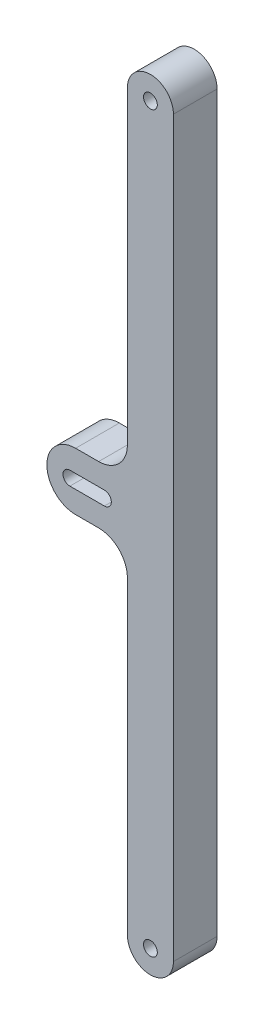
ISO-10303-21;
HEADER;
FILE_DESCRIPTION(('STEP AP214'),'2;1');
FILE_NAME('part.step','',(''),(''),'','','');
FILE_SCHEMA(('AUTOMOTIVE_DESIGN { 1 0 10303 214 1 1 1 1 }'));
ENDSEC;
DATA;
#1=APPLICATION_CONTEXT('core data for automotive mechanical design processes');
#2=APPLICATION_PROTOCOL_DEFINITION('international standard','automotive_design',2000,#1);
#3=PRODUCT_CONTEXT('',#1,'mechanical');
#4=PRODUCT('Part','Part','',(#3));
#5=PRODUCT_RELATED_PRODUCT_CATEGORY('part','',(#4));
#6=PRODUCT_DEFINITION_FORMATION('','',#4);
#7=PRODUCT_DEFINITION_CONTEXT('part definition',#1,'design');
#8=PRODUCT_DEFINITION('design','',#6,#7);
#9=PRODUCT_DEFINITION_SHAPE('','',#8);
#10=(LENGTH_UNIT() NAMED_UNIT(*) SI_UNIT(.MILLI.,.METRE.));
#11=(NAMED_UNIT(*) PLANE_ANGLE_UNIT() SI_UNIT($,.RADIAN.));
#12=(NAMED_UNIT(*) SI_UNIT($,.STERADIAN.) SOLID_ANGLE_UNIT());
#13=UNCERTAINTY_MEASURE_WITH_UNIT(LENGTH_MEASURE(1.E-05),#10,'distance_accuracy_value','');
#14=(GEOMETRIC_REPRESENTATION_CONTEXT(3) GLOBAL_UNCERTAINTY_ASSIGNED_CONTEXT((#13)) GLOBAL_UNIT_ASSIGNED_CONTEXT((#10,
#11,#12)) REPRESENTATION_CONTEXT('',''));
#15=CARTESIAN_POINT('',(0.,0.,0.));
#16=DIRECTION('',(0.,0.,1.));
#17=DIRECTION('',(1.,0.,0.));
#18=AXIS2_PLACEMENT_3D('',#15,#16,#17);
#19=CARTESIAN_POINT('',(-2.,-10.,0.));
#20=DIRECTION('',(-1.,0.,0.));
#21=DIRECTION('',(0.,0.,1.));
#22=AXIS2_PLACEMENT_3D('',#19,#20,#21);
#23=PLANE('',#22);
#24=DIRECTION('',(0.,1.,0.));
#25=VECTOR('',#24,1.);
#26=CARTESIAN_POINT('',(-2.,-10.,3.8));
#27=LINE('',#26,#25);
#28=CARTESIAN_POINT('',(-2.,-63.8,3.8));
#29=VERTEX_POINT('',#28);
#30=CARTESIAN_POINT('',(-2.,-36.9,3.8));
#31=VERTEX_POINT('',#30);
#32=EDGE_CURVE('E235',#29,#31,#27,.T.);
#33=ORIENTED_EDGE('',*,*,#32,.T.);
#34=DIRECTION('',(0.,0.,1.));
#35=VECTOR('',#34,1.);
#36=CARTESIAN_POINT('',(-2.,-36.9,0.));
#37=LINE('',#36,#35);
#38=CARTESIAN_POINT('',(-2.,-36.9,0.));
#39=VERTEX_POINT('',#38);
#40=EDGE_CURVE('E268',#31,#39,#37,.F.);
#41=ORIENTED_EDGE('',*,*,#40,.T.);
#42=DIRECTION('',(0.,1.,0.));
#43=VECTOR('',#42,1.);
#44=CARTESIAN_POINT('',(-2.,-10.,0.));
#45=LINE('',#44,#43);
#46=CARTESIAN_POINT('',(-2.,-63.8,0.));
#47=VERTEX_POINT('',#46);
#48=EDGE_CURVE('E226',#47,#39,#45,.T.);
#49=ORIENTED_EDGE('',*,*,#48,.F.);
#50=DIRECTION('',(0.,0.,1.));
#51=VECTOR('',#50,1.);
#52=CARTESIAN_POINT('',(-2.,-63.8,0.));
#53=LINE('',#52,#51);
#54=EDGE_CURVE('E201',#47,#29,#53,.T.);
#55=ORIENTED_EDGE('',*,*,#54,.T.);
#56=EDGE_LOOP('',(#33,#41,#49,#55));
#57=FACE_BOUND('',#56,.T.);
#58=ADVANCED_FACE('F39',(#57),#23,.T.);
#59=CARTESIAN_POINT('',(0.,0.,3.8));
#60=DIRECTION('',(0.,0.,1.));
#61=DIRECTION('',(1.,0.,0.));
#62=AXIS2_PLACEMENT_3D('',#59,#60,#61);
#63=PLANE('',#62);
#64=CARTESIAN_POINT('',(-4.,-31.9,3.8));
#65=DIRECTION('',(0.,0.,1.));
#66=DIRECTION('',(1.,0.,0.));
#67=AXIS2_PLACEMENT_3D('',#64,#65,#66);
#68=CIRCLE('',#67,0.600000000000003);
#69=CARTESIAN_POINT('',(-4.,-32.5,3.8));
#70=VERTEX_POINT('',#69);
#71=CARTESIAN_POINT('',(-4.,-31.3,3.8));
#72=VERTEX_POINT('',#71);
#73=EDGE_CURVE('E155',#70,#72,#68,.T.);
#74=ORIENTED_EDGE('',*,*,#73,.F.);
#75=DIRECTION('',(1.,0.,0.));
#76=VECTOR('',#75,1.);
#77=CARTESIAN_POINT('',(-4.,-32.5,3.8));
#78=LINE('',#77,#76);
#79=CARTESIAN_POINT('',(-7.,-32.5,3.8));
#80=VERTEX_POINT('',#79);
#81=EDGE_CURVE('E172',#80,#70,#78,.T.);
#82=ORIENTED_EDGE('',*,*,#81,.F.);
#83=CARTESIAN_POINT('',(-7.,-31.9,3.8));
#84=DIRECTION('',(0.,0.,1.));
#85=DIRECTION('',(1.,0.,0.));
#86=AXIS2_PLACEMENT_3D('',#83,#84,#85);
#87=CIRCLE('',#86,0.600000000000003);
#88=CARTESIAN_POINT('',(-7.,-31.3,3.8));
#89=VERTEX_POINT('',#88);
#90=EDGE_CURVE('E175',#89,#80,#87,.T.);
#91=ORIENTED_EDGE('',*,*,#90,.F.);
#92=DIRECTION('',(-1.,0.,0.));
#93=VECTOR('',#92,1.);
#94=CARTESIAN_POINT('',(-4.,-31.3,3.8));
#95=LINE('',#94,#93);
#96=EDGE_CURVE('E181',#72,#89,#95,.T.);
#97=ORIENTED_EDGE('',*,*,#96,.F.);
#98=EDGE_LOOP('',(#74,#82,#91,#97));
#99=FACE_BOUND('',#98,.T.);
#100=DIRECTION('',(-1.,0.,0.));
#101=VECTOR('',#100,1.);
#102=CARTESIAN_POINT('',(-2.,-29.4,3.8));
#103=LINE('',#102,#101);
#104=CARTESIAN_POINT('',(-4.5,-29.4,3.8));
#105=VERTEX_POINT('',#104);
#106=CARTESIAN_POINT('',(-6.5,-29.4,3.8));
#107=VERTEX_POINT('',#106);
#108=EDGE_CURVE('E187',#105,#107,#103,.T.);
#109=ORIENTED_EDGE('',*,*,#108,.T.);
#110=CARTESIAN_POINT('',(-6.5,-31.9,3.8));
#111=DIRECTION('',(0.,0.,1.));
#112=DIRECTION('',(1.,0.,0.));
#113=AXIS2_PLACEMENT_3D('',#110,#111,#112);
#114=CIRCLE('',#113,2.5);
#115=CARTESIAN_POINT('',(-9.,-31.9,3.8));
#116=VERTEX_POINT('',#115);
#117=EDGE_CURVE('E259',#107,#116,#114,.T.);
#118=ORIENTED_EDGE('',*,*,#117,.T.);
#119=CARTESIAN_POINT('',(-6.5,-31.9,3.8));
#120=DIRECTION('',(0.,0.,1.));
#121=DIRECTION('',(1.,0.,0.));
#122=AXIS2_PLACEMENT_3D('',#119,#120,#121);
#123=CIRCLE('',#122,2.5);
#124=CARTESIAN_POINT('',(-6.5,-34.4,3.8));
#125=VERTEX_POINT('',#124);
#126=EDGE_CURVE('E257',#116,#125,#123,.T.);
#127=ORIENTED_EDGE('',*,*,#126,.T.);
#128=DIRECTION('',(1.,0.,0.));
#129=VECTOR('',#128,1.);
#130=CARTESIAN_POINT('',(-2.,-34.4,3.8));
#131=LINE('',#130,#129);
#132=CARTESIAN_POINT('',(-4.5,-34.4,3.8));
#133=VERTEX_POINT('',#132);
#134=EDGE_CURVE('E194',#125,#133,#131,.T.);
#135=ORIENTED_EDGE('',*,*,#134,.T.);
#136=CARTESIAN_POINT('',(-4.5,-36.9,3.8));
#137=DIRECTION('',(0.,0.,1.));
#138=DIRECTION('',(1.,0.,0.));
#139=AXIS2_PLACEMENT_3D('',#136,#137,#138);
#140=CIRCLE('',#139,2.5);
#141=EDGE_CURVE('E48',#133,#31,#140,.F.);
#142=ORIENTED_EDGE('',*,*,#141,.T.);
#143=ORIENTED_EDGE('',*,*,#32,.F.);
#144=CARTESIAN_POINT('',(0.,-63.8,3.8));
#145=DIRECTION('',(0.,0.,-1.));
#146=DIRECTION('',(1.,0.,0.));
#147=AXIS2_PLACEMENT_3D('',#144,#145,#146);
#148=CIRCLE('',#147,2.);
#149=CARTESIAN_POINT('',(2.,-63.8,3.8));
#150=VERTEX_POINT('',#149);
#151=EDGE_CURVE('E214',#150,#29,#148,.T.);
#152=ORIENTED_EDGE('',*,*,#151,.F.);
#153=DIRECTION('',(0.,1.,0.));
#154=VECTOR('',#153,1.);
#155=CARTESIAN_POINT('',(2.,-10.,3.8));
#156=LINE('',#155,#154);
#157=CARTESIAN_POINT('',(2.,0.,3.8));
#158=VERTEX_POINT('',#157);
#159=EDGE_CURVE('E233',#150,#158,#156,.T.);
#160=ORIENTED_EDGE('',*,*,#159,.T.);
#161=CARTESIAN_POINT('',(0.,0.,3.8));
#162=DIRECTION('',(0.,0.,1.));
#163=DIRECTION('',(1.,0.,0.));
#164=AXIS2_PLACEMENT_3D('',#161,#162,#163);
#165=CIRCLE('',#164,2.);
#166=CARTESIAN_POINT('',(-2.,0.,3.8));
#167=VERTEX_POINT('',#166);
#168=EDGE_CURVE('E244',#158,#167,#165,.T.);
#169=ORIENTED_EDGE('',*,*,#168,.T.);
#170=CARTESIAN_POINT('',(-2.,-26.9,3.8));
#171=VERTEX_POINT('',#170);
#172=EDGE_CURVE('E225',#171,#167,#27,.T.);
#173=ORIENTED_EDGE('',*,*,#172,.F.);
#174=CARTESIAN_POINT('',(-4.5,-26.9,3.8));
#175=DIRECTION('',(0.,0.,1.));
#176=DIRECTION('',(1.,0.,0.));
#177=AXIS2_PLACEMENT_3D('',#174,#175,#176);
#178=CIRCLE('',#177,2.5);
#179=EDGE_CURVE('E270',#171,#105,#178,.F.);
#180=ORIENTED_EDGE('',*,*,#179,.T.);
#181=EDGE_LOOP('',(#109,#118,#127,#135,#142,#143,#152,#160,#169,#173,#180));
#182=FACE_BOUND('',#181,.T.);
#183=CARTESIAN_POINT('',(0.,0.,3.8));
#184=DIRECTION('',(0.,0.,1.));
#185=DIRECTION('',(1.,0.,0.));
#186=AXIS2_PLACEMENT_3D('',#183,#184,#185);
#187=CIRCLE('',#186,0.6);
#188=CARTESIAN_POINT('',(0.6,0.,3.8));
#189=VERTEX_POINT('',#188);
#190=EDGE_CURVE('E238',#189,#189,#187,.T.);
#191=ORIENTED_EDGE('',*,*,#190,.F.);
#192=EDGE_LOOP('',(#191));
#193=FACE_BOUND('',#192,.T.);
#194=CARTESIAN_POINT('',(0.,-63.8,3.8));
#195=DIRECTION('',(0.,0.,-1.));
#196=DIRECTION('',(1.,0.,0.));
#197=AXIS2_PLACEMENT_3D('',#194,#195,#196);
#198=CIRCLE('',#197,0.6);
#199=CARTESIAN_POINT('',(0.6,-63.8,3.8));
#200=VERTEX_POINT('',#199);
#201=EDGE_CURVE('E208',#200,#200,#198,.T.);
#202=ORIENTED_EDGE('',*,*,#201,.T.);
#203=EDGE_LOOP('',(#202));
#204=FACE_BOUND('',#203,.T.);
#205=ADVANCED_FACE('F275',(#99,#182,#193,#204),#63,.T.);
#206=CARTESIAN_POINT('',(0.,0.,0.));
#207=DIRECTION('',(0.,0.,1.));
#208=DIRECTION('',(1.,0.,0.));
#209=AXIS2_PLACEMENT_3D('',#206,#207,#208);
#210=PLANE('',#209);
#211=DIRECTION('',(1.,0.,0.));
#212=VECTOR('',#211,1.);
#213=CARTESIAN_POINT('',(-4.,-32.5,0.));
#214=LINE('',#213,#212);
#215=CARTESIAN_POINT('',(-7.,-32.5,0.));
#216=VERTEX_POINT('',#215);
#217=CARTESIAN_POINT('',(-4.,-32.5,0.));
#218=VERTEX_POINT('',#217);
#219=EDGE_CURVE('E160',#216,#218,#214,.T.);
#220=ORIENTED_EDGE('',*,*,#219,.T.);
#221=CARTESIAN_POINT('',(-4.,-31.9,0.));
#222=DIRECTION('',(0.,0.,1.));
#223=DIRECTION('',(1.,0.,0.));
#224=AXIS2_PLACEMENT_3D('',#221,#222,#223);
#225=CIRCLE('',#224,0.600000000000003);
#226=CARTESIAN_POINT('',(-4.,-31.3,0.));
#227=VERTEX_POINT('',#226);
#228=EDGE_CURVE('E152',#218,#227,#225,.T.);
#229=ORIENTED_EDGE('',*,*,#228,.T.);
#230=DIRECTION('',(-1.,0.,0.));
#231=VECTOR('',#230,1.);
#232=CARTESIAN_POINT('',(-4.,-31.3,0.));
#233=LINE('',#232,#231);
#234=CARTESIAN_POINT('',(-7.,-31.3,0.));
#235=VERTEX_POINT('',#234);
#236=EDGE_CURVE('E164',#227,#235,#233,.T.);
#237=ORIENTED_EDGE('',*,*,#236,.T.);
#238=CARTESIAN_POINT('',(-7.,-31.9,0.));
#239=DIRECTION('',(0.,0.,1.));
#240=DIRECTION('',(1.,0.,0.));
#241=AXIS2_PLACEMENT_3D('',#238,#239,#240);
#242=CIRCLE('',#241,0.600000000000003);
#243=EDGE_CURVE('E168',#235,#216,#242,.T.);
#244=ORIENTED_EDGE('',*,*,#243,.T.);
#245=EDGE_LOOP('',(#220,#229,#237,#244));
#246=FACE_BOUND('',#245,.T.);
#247=CARTESIAN_POINT('',(-6.5,-31.9,0.));
#248=DIRECTION('',(0.,0.,1.));
#249=DIRECTION('',(1.,0.,0.));
#250=AXIS2_PLACEMENT_3D('',#247,#248,#249);
#251=CIRCLE('',#250,2.5);
#252=CARTESIAN_POINT('',(-6.5,-34.4,0.));
#253=VERTEX_POINT('',#252);
#254=CARTESIAN_POINT('',(-9.,-31.9,0.));
#255=VERTEX_POINT('',#254);
#256=EDGE_CURVE('E55',#253,#255,#251,.F.);
#257=ORIENTED_EDGE('',*,*,#256,.T.);
#258=CARTESIAN_POINT('',(-6.5,-31.9,0.));
#259=DIRECTION('',(0.,0.,1.));
#260=DIRECTION('',(1.,0.,0.));
#261=AXIS2_PLACEMENT_3D('',#258,#259,#260);
#262=CIRCLE('',#261,2.5);
#263=CARTESIAN_POINT('',(-6.5,-29.4,0.));
#264=VERTEX_POINT('',#263);
#265=EDGE_CURVE('E262',#255,#264,#262,.F.);
#266=ORIENTED_EDGE('',*,*,#265,.T.);
#267=DIRECTION('',(1.,0.,0.));
#268=VECTOR('',#267,1.);
#269=CARTESIAN_POINT('',(-2.,-29.4,0.));
#270=LINE('',#269,#268);
#271=CARTESIAN_POINT('',(-4.5,-29.4,0.));
#272=VERTEX_POINT('',#271);
#273=EDGE_CURVE('E193',#264,#272,#270,.T.);
#274=ORIENTED_EDGE('',*,*,#273,.T.);
#275=CARTESIAN_POINT('',(-4.5,-26.9,0.));
#276=DIRECTION('',(0.,0.,1.));
#277=DIRECTION('',(1.,0.,0.));
#278=AXIS2_PLACEMENT_3D('',#275,#276,#277);
#279=CIRCLE('',#278,2.5);
#280=CARTESIAN_POINT('',(-2.,-26.9,0.));
#281=VERTEX_POINT('',#280);
#282=EDGE_CURVE('E272',#272,#281,#279,.T.);
#283=ORIENTED_EDGE('',*,*,#282,.T.);
#284=CARTESIAN_POINT('',(-2.,0.,0.));
#285=VERTEX_POINT('',#284);
#286=EDGE_CURVE('E230',#281,#285,#45,.T.);
#287=ORIENTED_EDGE('',*,*,#286,.T.);
#288=CARTESIAN_POINT('',(0.,0.,0.));
#289=DIRECTION('',(0.,0.,1.));
#290=DIRECTION('',(1.,0.,0.));
#291=AXIS2_PLACEMENT_3D('',#288,#289,#290);
#292=CIRCLE('',#291,2.);
#293=CARTESIAN_POINT('',(2.,0.,0.));
#294=VERTEX_POINT('',#293);
#295=EDGE_CURVE('E241',#294,#285,#292,.T.);
#296=ORIENTED_EDGE('',*,*,#295,.F.);
#297=DIRECTION('',(0.,1.,0.));
#298=VECTOR('',#297,1.);
#299=CARTESIAN_POINT('',(2.,-10.,0.));
#300=LINE('',#299,#298);
#301=CARTESIAN_POINT('',(2.,-63.8,0.));
#302=VERTEX_POINT('',#301);
#303=EDGE_CURVE('E231',#302,#294,#300,.T.);
#304=ORIENTED_EDGE('',*,*,#303,.F.);
#305=CARTESIAN_POINT('',(0.,-63.8,0.));
#306=DIRECTION('',(0.,0.,-1.));
#307=DIRECTION('',(1.,0.,0.));
#308=AXIS2_PLACEMENT_3D('',#305,#306,#307);
#309=CIRCLE('',#308,2.);
#310=EDGE_CURVE('E211',#302,#47,#309,.T.);
#311=ORIENTED_EDGE('',*,*,#310,.T.);
#312=ORIENTED_EDGE('',*,*,#48,.T.);
#313=CARTESIAN_POINT('',(-4.5,-36.9,0.));
#314=DIRECTION('',(0.,0.,1.));
#315=DIRECTION('',(1.,0.,0.));
#316=AXIS2_PLACEMENT_3D('',#313,#314,#315);
#317=CIRCLE('',#316,2.5);
#318=CARTESIAN_POINT('',(-4.5,-34.4,0.));
#319=VERTEX_POINT('',#318);
#320=EDGE_CURVE('E11',#39,#319,#317,.T.);
#321=ORIENTED_EDGE('',*,*,#320,.T.);
#322=DIRECTION('',(-1.,0.,0.));
#323=VECTOR('',#322,1.);
#324=CARTESIAN_POINT('',(-2.,-34.4,0.));
#325=LINE('',#324,#323);
#326=EDGE_CURVE('E191',#319,#253,#325,.T.);
#327=ORIENTED_EDGE('',*,*,#326,.T.);
#328=EDGE_LOOP('',(#257,#266,#274,#283,#287,#296,#304,#311,#312,#321,#327));
#329=FACE_BOUND('',#328,.T.);
#330=CARTESIAN_POINT('',(0.,0.,0.));
#331=DIRECTION('',(0.,0.,1.));
#332=DIRECTION('',(1.,0.,0.));
#333=AXIS2_PLACEMENT_3D('',#330,#331,#332);
#334=CIRCLE('',#333,0.6);
#335=CARTESIAN_POINT('',(0.6,0.,0.));
#336=VERTEX_POINT('',#335);
#337=EDGE_CURVE('E229',#336,#336,#334,.T.);
#338=ORIENTED_EDGE('',*,*,#337,.T.);
#339=EDGE_LOOP('',(#338));
#340=FACE_BOUND('',#339,.T.);
#341=CARTESIAN_POINT('',(0.,-63.8,0.));
#342=DIRECTION('',(0.,0.,-1.));
#343=DIRECTION('',(1.,0.,0.));
#344=AXIS2_PLACEMENT_3D('',#341,#342,#343);
#345=CIRCLE('',#344,0.6);
#346=CARTESIAN_POINT('',(0.6,-63.8,0.));
#347=VERTEX_POINT('',#346);
#348=EDGE_CURVE('E207',#347,#347,#345,.T.);
#349=ORIENTED_EDGE('',*,*,#348,.F.);
#350=EDGE_LOOP('',(#349));
#351=FACE_BOUND('',#350,.T.);
#352=ADVANCED_FACE('F170',(#246,#329,#340,#351),#210,.F.);
#353=CARTESIAN_POINT('',(0.,0.,3.8));
#354=DIRECTION('',(0.,0.,-1.));
#355=DIRECTION('',(-1.,0.,0.));
#356=AXIS2_PLACEMENT_3D('',#353,#354,#355);
#357=CYLINDRICAL_SURFACE('',#356,2.);
#358=ORIENTED_EDGE('',*,*,#168,.F.);
#359=DIRECTION('',(0.,0.,-1.));
#360=VECTOR('',#359,1.);
#361=CARTESIAN_POINT('',(2.,0.,0.));
#362=LINE('',#361,#360);
#363=EDGE_CURVE('E222',#158,#294,#362,.T.);
#364=ORIENTED_EDGE('',*,*,#363,.T.);
#365=ORIENTED_EDGE('',*,*,#295,.T.);
#366=DIRECTION('',(0.,0.,1.));
#367=VECTOR('',#366,1.);
#368=CARTESIAN_POINT('',(-2.,0.,0.));
#369=LINE('',#368,#367);
#370=EDGE_CURVE('E217',#285,#167,#369,.T.);
#371=ORIENTED_EDGE('',*,*,#370,.T.);
#372=EDGE_LOOP('',(#358,#364,#365,#371));
#373=FACE_BOUND('',#372,.T.);
#374=ADVANCED_FACE('F311',(#373),#357,.T.);
#375=CARTESIAN_POINT('',(0.,0.,3.8));
#376=DIRECTION('',(0.,0.,-1.));
#377=DIRECTION('',(-1.,0.,0.));
#378=AXIS2_PLACEMENT_3D('',#375,#376,#377);
#379=CYLINDRICAL_SURFACE('',#378,0.6);
#380=ORIENTED_EDGE('',*,*,#337,.F.);
#381=EDGE_LOOP('',(#380));
#382=FACE_BOUND('',#381,.T.);
#383=ORIENTED_EDGE('',*,*,#190,.T.);
#384=EDGE_LOOP('',(#383));
#385=FACE_BOUND('',#384,.T.);
#386=ADVANCED_FACE('F339',(#382,#385),#379,.F.);
#387=ORIENTED_EDGE('',*,*,#286,.F.);
#388=DIRECTION('',(0.,0.,1.));
#389=VECTOR('',#388,1.);
#390=CARTESIAN_POINT('',(-2.,-26.9,3.8));
#391=LINE('',#390,#389);
#392=EDGE_CURVE('E247',#281,#171,#391,.T.);
#393=ORIENTED_EDGE('',*,*,#392,.T.);
#394=ORIENTED_EDGE('',*,*,#172,.T.);
#395=ORIENTED_EDGE('',*,*,#370,.F.);
#396=EDGE_LOOP('',(#387,#393,#394,#395));
#397=FACE_BOUND('',#396,.T.);
#398=ADVANCED_FACE('F307',(#397),#23,.T.);
#399=CARTESIAN_POINT('',(2.,-10.,0.));
#400=DIRECTION('',(1.,0.,0.));
#401=DIRECTION('',(0.,0.,-1.));
#402=AXIS2_PLACEMENT_3D('',#399,#400,#401);
#403=PLANE('',#402);
#404=ORIENTED_EDGE('',*,*,#363,.F.);
#405=ORIENTED_EDGE('',*,*,#159,.F.);
#406=DIRECTION('',(0.,0.,-1.));
#407=VECTOR('',#406,1.);
#408=CARTESIAN_POINT('',(2.,-63.8,0.));
#409=LINE('',#408,#407);
#410=EDGE_CURVE('E204',#150,#302,#409,.T.);
#411=ORIENTED_EDGE('',*,*,#410,.T.);
#412=ORIENTED_EDGE('',*,*,#303,.T.);
#413=EDGE_LOOP('',(#404,#405,#411,#412));
#414=FACE_BOUND('',#413,.T.);
#415=ADVANCED_FACE('F316',(#414),#403,.T.);
#416=CARTESIAN_POINT('',(0.,-63.8,3.8));
#417=DIRECTION('',(0.,0.,-1.));
#418=DIRECTION('',(-1.,0.,0.));
#419=AXIS2_PLACEMENT_3D('',#416,#417,#418);
#420=CYLINDRICAL_SURFACE('',#419,2.);
#421=ORIENTED_EDGE('',*,*,#151,.T.);
#422=ORIENTED_EDGE('',*,*,#54,.F.);
#423=ORIENTED_EDGE('',*,*,#310,.F.);
#424=ORIENTED_EDGE('',*,*,#410,.F.);
#425=EDGE_LOOP('',(#421,#422,#423,#424));
#426=FACE_BOUND('',#425,.T.);
#427=ADVANCED_FACE('F318',(#426),#420,.T.);
#428=CARTESIAN_POINT('',(0.,-63.8,3.8));
#429=DIRECTION('',(0.,0.,-1.));
#430=DIRECTION('',(-1.,0.,0.));
#431=AXIS2_PLACEMENT_3D('',#428,#429,#430);
#432=CYLINDRICAL_SURFACE('',#431,0.6);
#433=ORIENTED_EDGE('',*,*,#348,.T.);
#434=EDGE_LOOP('',(#433));
#435=FACE_BOUND('',#434,.T.);
#436=ORIENTED_EDGE('',*,*,#201,.F.);
#437=EDGE_LOOP('',(#436));
#438=FACE_BOUND('',#437,.T.);
#439=ADVANCED_FACE('F320',(#435,#438),#432,.F.);
#440=CARTESIAN_POINT('',(-2.,-34.4,-8.60232526704263));
#441=DIRECTION('',(0.,-1.,0.));
#442=DIRECTION('',(0.,0.,-1.));
#443=AXIS2_PLACEMENT_3D('',#440,#441,#442);
#444=PLANE('',#443);
#445=ORIENTED_EDGE('',*,*,#134,.F.);
#446=DIRECTION('',(0.,0.,1.));
#447=VECTOR('',#446,1.);
#448=CARTESIAN_POINT('',(-6.5,-34.4,-8.60232526704263));
#449=LINE('',#448,#447);
#450=EDGE_CURVE('E63',#125,#253,#449,.F.);
#451=ORIENTED_EDGE('',*,*,#450,.T.);
#452=ORIENTED_EDGE('',*,*,#326,.F.);
#453=DIRECTION('',(0.,0.,1.));
#454=VECTOR('',#453,1.);
#455=CARTESIAN_POINT('',(-4.5,-34.4,3.8));
#456=LINE('',#455,#454);
#457=EDGE_CURVE('E264',#319,#133,#456,.T.);
#458=ORIENTED_EDGE('',*,*,#457,.T.);
#459=EDGE_LOOP('',(#445,#451,#452,#458));
#460=FACE_BOUND('',#459,.T.);
#461=ADVANCED_FACE('F285',(#460),#444,.T.);
#462=CARTESIAN_POINT('',(-2.,-29.4,-8.60232526704263));
#463=DIRECTION('',(0.,1.,0.));
#464=DIRECTION('',(0.,0.,1.));
#465=AXIS2_PLACEMENT_3D('',#462,#463,#464);
#466=PLANE('',#465);
#467=ORIENTED_EDGE('',*,*,#108,.F.);
#468=DIRECTION('',(0.,0.,1.));
#469=VECTOR('',#468,1.);
#470=CARTESIAN_POINT('',(-4.5,-29.4,0.));
#471=LINE('',#470,#469);
#472=EDGE_CURVE('E255',#105,#272,#471,.F.);
#473=ORIENTED_EDGE('',*,*,#472,.T.);
#474=ORIENTED_EDGE('',*,*,#273,.F.);
#475=DIRECTION('',(0.,0.,1.));
#476=VECTOR('',#475,1.);
#477=CARTESIAN_POINT('',(-6.5,-29.4,-8.60232526704263));
#478=LINE('',#477,#476);
#479=EDGE_CURVE('E252',#264,#107,#478,.T.);
#480=ORIENTED_EDGE('',*,*,#479,.T.);
#481=EDGE_LOOP('',(#467,#473,#474,#480));
#482=FACE_BOUND('',#481,.T.);
#483=ADVANCED_FACE('F298',(#482),#466,.T.);
#484=CARTESIAN_POINT('',(-4.,-31.9,0.));
#485=DIRECTION('',(0.,0.,1.));
#486=DIRECTION('',(1.,0.,0.));
#487=AXIS2_PLACEMENT_3D('',#484,#485,#486);
#488=CYLINDRICAL_SURFACE('',#487,0.600000000000003);
#489=ORIENTED_EDGE('',*,*,#73,.T.);
#490=DIRECTION('',(0.,0.,1.));
#491=VECTOR('',#490,1.);
#492=CARTESIAN_POINT('',(-4.,-31.3,0.));
#493=LINE('',#492,#491);
#494=EDGE_CURVE('E148',#227,#72,#493,.T.);
#495=ORIENTED_EDGE('',*,*,#494,.F.);
#496=ORIENTED_EDGE('',*,*,#228,.F.);
#497=DIRECTION('',(0.,0.,1.));
#498=VECTOR('',#497,1.);
#499=CARTESIAN_POINT('',(-4.,-32.5,0.));
#500=LINE('',#499,#498);
#501=EDGE_CURVE('E185',#218,#70,#500,.T.);
#502=ORIENTED_EDGE('',*,*,#501,.T.);
#503=EDGE_LOOP('',(#489,#495,#496,#502));
#504=FACE_BOUND('',#503,.T.);
#505=ADVANCED_FACE('F150',(#504),#488,.F.);
#506=CARTESIAN_POINT('',(-4.,-32.5,0.));
#507=DIRECTION('',(0.,-1.,0.));
#508=DIRECTION('',(0.,0.,-1.));
#509=AXIS2_PLACEMENT_3D('',#506,#507,#508);
#510=PLANE('',#509);
#511=ORIENTED_EDGE('',*,*,#81,.T.);
#512=ORIENTED_EDGE('',*,*,#501,.F.);
#513=ORIENTED_EDGE('',*,*,#219,.F.);
#514=DIRECTION('',(0.,0.,1.));
#515=VECTOR('',#514,1.);
#516=CARTESIAN_POINT('',(-7.,-32.5,0.));
#517=LINE('',#516,#515);
#518=EDGE_CURVE('E188',#216,#80,#517,.T.);
#519=ORIENTED_EDGE('',*,*,#518,.T.);
#520=EDGE_LOOP('',(#511,#512,#513,#519));
#521=FACE_BOUND('',#520,.T.);
#522=ADVANCED_FACE('F408',(#521),#510,.F.);
#523=CARTESIAN_POINT('',(-7.,-31.9,0.));
#524=DIRECTION('',(0.,0.,1.));
#525=DIRECTION('',(1.,0.,0.));
#526=AXIS2_PLACEMENT_3D('',#523,#524,#525);
#527=CYLINDRICAL_SURFACE('',#526,0.600000000000003);
#528=ORIENTED_EDGE('',*,*,#90,.T.);
#529=ORIENTED_EDGE('',*,*,#518,.F.);
#530=ORIENTED_EDGE('',*,*,#243,.F.);
#531=DIRECTION('',(0.,0.,1.));
#532=VECTOR('',#531,1.);
#533=CARTESIAN_POINT('',(-7.,-31.3,0.));
#534=LINE('',#533,#532);
#535=EDGE_CURVE('E159',#235,#89,#534,.T.);
#536=ORIENTED_EDGE('',*,*,#535,.T.);
#537=EDGE_LOOP('',(#528,#529,#530,#536));
#538=FACE_BOUND('',#537,.T.);
#539=ADVANCED_FACE('F398',(#538),#527,.F.);
#540=CARTESIAN_POINT('',(-4.,-31.3,0.));
#541=DIRECTION('',(0.,1.,0.));
#542=DIRECTION('',(0.,0.,1.));
#543=AXIS2_PLACEMENT_3D('',#540,#541,#542);
#544=PLANE('',#543);
#545=ORIENTED_EDGE('',*,*,#96,.T.);
#546=ORIENTED_EDGE('',*,*,#535,.F.);
#547=ORIENTED_EDGE('',*,*,#236,.F.);
#548=ORIENTED_EDGE('',*,*,#494,.T.);
#549=EDGE_LOOP('',(#545,#546,#547,#548));
#550=FACE_BOUND('',#549,.T.);
#551=ADVANCED_FACE('F165',(#550),#544,.F.);
#552=CARTESIAN_POINT('',(-4.5,-26.9,0.));
#553=DIRECTION('',(0.,0.,-1.));
#554=DIRECTION('',(-1.,0.,0.));
#555=AXIS2_PLACEMENT_3D('',#552,#553,#554);
#556=CYLINDRICAL_SURFACE('',#555,2.5);
#557=ORIENTED_EDGE('',*,*,#282,.F.);
#558=ORIENTED_EDGE('',*,*,#472,.F.);
#559=ORIENTED_EDGE('',*,*,#179,.F.);
#560=ORIENTED_EDGE('',*,*,#392,.F.);
#561=EDGE_LOOP('',(#557,#558,#559,#560));
#562=FACE_BOUND('',#561,.T.);
#563=ADVANCED_FACE('F301',(#562),#556,.F.);
#564=CARTESIAN_POINT('',(-6.5,-31.9,-8.60232526704263));
#565=DIRECTION('',(0.,0.,1.));
#566=DIRECTION('',(1.,0.,0.));
#567=AXIS2_PLACEMENT_3D('',#564,#565,#566);
#568=CYLINDRICAL_SURFACE('',#567,2.5);
#569=DIRECTION('',(0.,0.,1.));
#570=VECTOR('',#569,1.);
#571=CARTESIAN_POINT('',(-9.,-31.9,-8.60232526704263));
#572=LINE('',#571,#570);
#573=EDGE_CURVE('E43',#255,#116,#572,.T.);
#574=ORIENTED_EDGE('',*,*,#573,.F.);
#575=ORIENTED_EDGE('',*,*,#256,.F.);
#576=ORIENTED_EDGE('',*,*,#450,.F.);
#577=ORIENTED_EDGE('',*,*,#126,.F.);
#578=EDGE_LOOP('',(#574,#575,#576,#577));
#579=FACE_BOUND('',#578,.T.);
#580=ADVANCED_FACE('F288',(#579),#568,.T.);
#581=CARTESIAN_POINT('',(-6.5,-31.9,-8.60232526704263));
#582=DIRECTION('',(0.,0.,1.));
#583=DIRECTION('',(1.,0.,0.));
#584=AXIS2_PLACEMENT_3D('',#581,#582,#583);
#585=CYLINDRICAL_SURFACE('',#584,2.5);
#586=ORIENTED_EDGE('',*,*,#265,.F.);
#587=ORIENTED_EDGE('',*,*,#573,.T.);
#588=ORIENTED_EDGE('',*,*,#117,.F.);
#589=ORIENTED_EDGE('',*,*,#479,.F.);
#590=EDGE_LOOP('',(#586,#587,#588,#589));
#591=FACE_BOUND('',#590,.T.);
#592=ADVANCED_FACE('F293',(#591),#585,.T.);
#593=CARTESIAN_POINT('',(-4.5,-36.9,-8.60232526704263));
#594=DIRECTION('',(0.,0.,-1.));
#595=DIRECTION('',(-1.,0.,0.));
#596=AXIS2_PLACEMENT_3D('',#593,#594,#595);
#597=CYLINDRICAL_SURFACE('',#596,2.5);
#598=ORIENTED_EDGE('',*,*,#320,.F.);
#599=ORIENTED_EDGE('',*,*,#40,.F.);
#600=ORIENTED_EDGE('',*,*,#141,.F.);
#601=ORIENTED_EDGE('',*,*,#457,.F.);
#602=EDGE_LOOP('',(#598,#599,#600,#601));
#603=FACE_BOUND('',#602,.T.);
#604=ADVANCED_FACE('F41',(#603),#597,.F.);
#605=CLOSED_SHELL('',(#58,#205,#352,#374,#386,#398,#415,#427,#439,#461,#483,#505,#522,#539,#551,
#563,#580,#592,#604));
#606=MANIFOLD_SOLID_BREP('B2',#605);
#607=ADVANCED_BREP_SHAPE_REPRESENTATION('',(#18,#606),#14);
#608=SHAPE_DEFINITION_REPRESENTATION(#9,#607);
ENDSEC;
END-ISO-10303-21;
